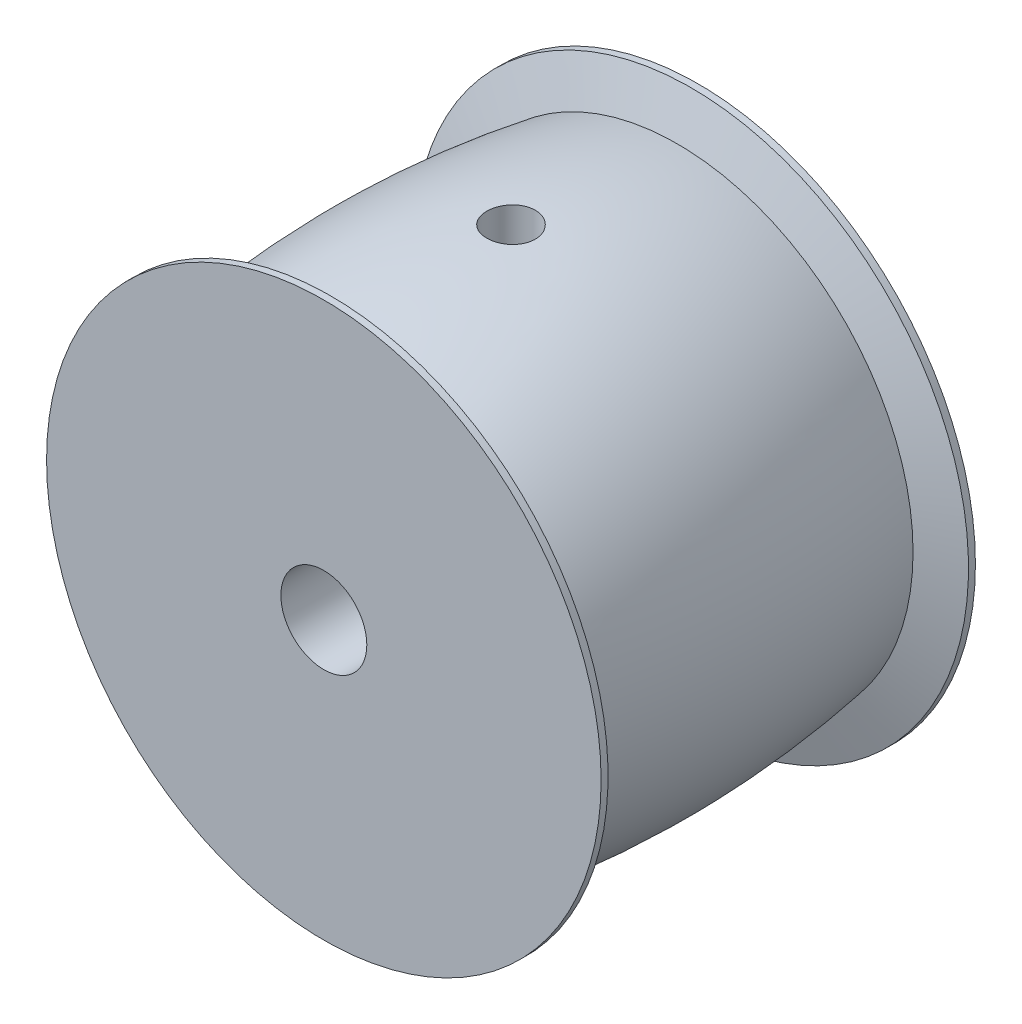
ISO-10303-21;
HEADER;
FILE_DESCRIPTION(('STEP AP214'),'2;1');
FILE_NAME('part.step','',(''),(''),'','','');
FILE_SCHEMA(('AUTOMOTIVE_DESIGN { 1 0 10303 214 1 1 1 1 }'));
ENDSEC;
DATA;
#1=APPLICATION_CONTEXT('core data for automotive mechanical design processes');
#2=APPLICATION_PROTOCOL_DEFINITION('international standard','automotive_design',2000,#1);
#3=PRODUCT_CONTEXT('',#1,'mechanical');
#4=PRODUCT('Part','Part','',(#3));
#5=PRODUCT_RELATED_PRODUCT_CATEGORY('part','',(#4));
#6=PRODUCT_DEFINITION_FORMATION('','',#4);
#7=PRODUCT_DEFINITION_CONTEXT('part definition',#1,'design');
#8=PRODUCT_DEFINITION('design','',#6,#7);
#9=PRODUCT_DEFINITION_SHAPE('','',#8);
#10=(LENGTH_UNIT() NAMED_UNIT(*) SI_UNIT(.MILLI.,.METRE.));
#11=(NAMED_UNIT(*) PLANE_ANGLE_UNIT() SI_UNIT($,.RADIAN.));
#12=(NAMED_UNIT(*) SI_UNIT($,.STERADIAN.) SOLID_ANGLE_UNIT());
#13=UNCERTAINTY_MEASURE_WITH_UNIT(LENGTH_MEASURE(1.E-05),#10,'distance_accuracy_value','');
#14=(GEOMETRIC_REPRESENTATION_CONTEXT(3) GLOBAL_UNCERTAINTY_ASSIGNED_CONTEXT((#13)) GLOBAL_UNIT_ASSIGNED_CONTEXT((#10,
#11,#12)) REPRESENTATION_CONTEXT('',''));
#15=CARTESIAN_POINT('',(0.,0.,0.));
#16=DIRECTION('',(0.,0.,1.));
#17=DIRECTION('',(1.,0.,0.));
#18=AXIS2_PLACEMENT_3D('',#15,#16,#17);
#19=CARTESIAN_POINT('',(0.,0.,15.));
#20=DIRECTION('',(0.,0.,-1.));
#21=DIRECTION('',(-1.,0.,0.));
#22=AXIS2_PLACEMENT_3D('',#19,#20,#21);
#23=CYLINDRICAL_SURFACE('',#22,20.);
#24=CARTESIAN_POINT('',(0.,0.,26.5));
#25=DIRECTION('',(0.,0.,-1.));
#26=DIRECTION('',(-1.,0.,0.));
#27=AXIS2_PLACEMENT_3D('',#24,#25,#26);
#28=CIRCLE('',#27,20.);
#29=CARTESIAN_POINT('',(-20.,0.,26.5));
#30=VERTEX_POINT('',#29);
#31=EDGE_CURVE('E102',#30,#30,#28,.T.);
#32=ORIENTED_EDGE('',*,*,#31,.F.);
#33=EDGE_LOOP('',(#32));
#34=FACE_BOUND('',#33,.T.);
#35=CARTESIAN_POINT('',(0.,0.,27.));
#36=DIRECTION('',(0.,0.,1.));
#37=DIRECTION('',(1.,0.,0.));
#38=AXIS2_PLACEMENT_3D('',#35,#36,#37);
#39=CIRCLE('',#38,20.);
#40=CARTESIAN_POINT('',(20.,0.,27.));
#41=VERTEX_POINT('',#40);
#42=EDGE_CURVE('E50',#41,#41,#39,.T.);
#43=ORIENTED_EDGE('',*,*,#42,.F.);
#44=EDGE_LOOP('',(#43));
#45=FACE_BOUND('',#44,.T.);
#46=ADVANCED_FACE('F33',(#34,#45),#23,.T.);
#47=CARTESIAN_POINT('',(0.,0.,15.));
#48=DIRECTION('',(0.,0.,-1.));
#49=DIRECTION('',(-1.,0.,0.));
#50=AXIS2_PLACEMENT_3D('',#47,#48,#49);
#51=CYLINDRICAL_SURFACE('',#50,3.1);
#52=CARTESIAN_POINT('',(0.,-3.1,15.25));
#53=CARTESIAN_POINT('',(0.090621719283177,-3.10000420251891,15.2500047849042));
#54=CARTESIAN_POINT('',(0.181216357350658,-3.09599361262121,15.2429313050754));
#55=CARTESIAN_POINT('',(0.35957780199557,-3.08037600695116,15.2150365486299));
#56=CARTESIAN_POINT('',(0.447344414991771,-3.06876847231424,15.1942143329859));
#57=CARTESIAN_POINT('',(0.617310726588606,-3.0391370149575,15.1399286560735));
#58=CARTESIAN_POINT('',(0.699529692760567,-3.02113682197074,15.1065119183129));
#59=CARTESIAN_POINT('',(0.857031711210553,-2.98028939192881,15.0283112983114));
#60=CARTESIAN_POINT('',(0.932313034626219,-2.95744095134875,14.983524593056));
#61=CARTESIAN_POINT('',(1.07978906311454,-2.90698346095951,14.8802986521798));
#62=CARTESIAN_POINT('',(1.15138593607805,-2.87915167623758,14.8211162862625));
#63=CARTESIAN_POINT('',(1.28421331975523,-2.8224144507107,14.6924183335605));
#64=CARTESIAN_POINT('',(1.34543279861919,-2.79350790666607,14.622891895911));
#65=CARTESIAN_POINT('',(1.46229411961439,-2.73430465023166,14.4667887965138));
#66=CARTESIAN_POINT('',(1.5166665735016,-2.70418289998332,14.3791872394937));
#67=CARTESIAN_POINT('',(1.609675881698,-2.64987937042414,14.1943384057256));
#68=CARTESIAN_POINT('',(1.64833593628469,-2.62568885440689,14.0971056160422));
#69=CARTESIAN_POINT('',(1.70150963094453,-2.59145518002551,13.9173157462224));
#70=CARTESIAN_POINT('',(1.71943816550077,-2.57948333998774,13.8361362288567));
#71=CARTESIAN_POINT('',(1.74357771038549,-2.56323199559777,13.6713291153105));
#72=CARTESIAN_POINT('',(1.74980081806947,-2.55894454977383,13.5877041373724));
#73=CARTESIAN_POINT('',(1.75019000557479,-2.55867835879088,13.4203114066287));
#74=CARTESIAN_POINT('',(1.74434110099241,-2.56270993963493,13.3365436054935));
#75=CARTESIAN_POINT('',(1.72089819107621,-2.57850748792416,13.1714028802869));
#76=CARTESIAN_POINT('',(1.70329630726807,-2.59027864342314,13.0900316009248));
#77=CARTESIAN_POINT('',(1.657249219719,-2.61997411465452,12.9318407189205));
#78=CARTESIAN_POINT('',(1.62882584343232,-2.63788603698261,12.8550123111496));
#79=CARTESIAN_POINT('',(1.56211502771627,-2.6779296445262,12.7069694820497));
#80=CARTESIAN_POINT('',(1.52382377482534,-2.70006296024663,12.6357572450279));
#81=CARTESIAN_POINT('',(1.43152641798009,-2.75025461648012,12.4891258094877));
#82=CARTESIAN_POINT('',(1.37599821655095,-2.77869797678232,12.4147951010557));
#83=CARTESIAN_POINT('',(1.25396554584119,-2.83586261379248,12.2758130695992));
#84=CARTESIAN_POINT('',(1.18745202051661,-2.86458410123713,12.2111698172564));
#85=CARTESIAN_POINT('',(1.03668696229015,-2.92275316652969,12.0863673803893));
#86=CARTESIAN_POINT('',(0.951294520660871,-2.95194248846239,12.0274520824283));
#87=CARTESIAN_POINT('',(0.770019788773487,-3.00432119579068,11.9250773148562));
#88=CARTESIAN_POINT('',(0.674144309711803,-3.02751444446835,11.8816078866452));
#89=CARTESIAN_POINT('',(0.481557855383653,-3.06382395270728,11.814696030865));
#90=CARTESIAN_POINT('',(0.385375466158948,-3.07753210375159,11.7900644089745));
#91=CARTESIAN_POINT('',(0.18940720801987,-3.09576725220434,11.7574546104323));
#92=CARTESIAN_POINT('',(0.0896248164390424,-3.10030288006434,11.7494607790322));
#93=CARTESIAN_POINT('',(-0.0980017075441083,-3.09970207643259,11.7505301242385));
#94=CARTESIAN_POINT('',(-0.185867474628647,-3.09564209414477,11.7576948777465));
#95=CARTESIAN_POINT('',(-0.3589156589367,-3.08037695843105,11.7849634646361));
#96=CARTESIAN_POINT('',(-0.444098011144977,-3.06917163202338,11.8050676112677));
#97=CARTESIAN_POINT('',(-0.608959335053683,-3.04074411584778,11.8571081704522));
#98=CARTESIAN_POINT('',(-0.688673862285319,-3.02356633060952,11.8889573631218));
#99=CARTESIAN_POINT('',(-0.841697084178722,-2.9845918539727,11.9633506618381));
#100=CARTESIAN_POINT('',(-0.915004155989898,-2.96279399718413,12.0058974668093));
#101=CARTESIAN_POINT('',(-1.06131590983964,-2.91378805642279,12.1054634829432));
#102=CARTESIAN_POINT('',(-1.13350006162199,-2.8862532905604,12.1635262572151));
#103=CARTESIAN_POINT('',(-1.26766006186162,-2.82990189416845,12.2900193281403));
#104=CARTESIAN_POINT('',(-1.32962423801516,-2.80108384502935,12.3584613101171));
#105=CARTESIAN_POINT('',(-1.4483101193777,-2.74176063331579,12.5124125153855));
#106=CARTESIAN_POINT('',(-1.50376450235781,-2.71140414934628,12.5989639401409));
#107=CARTESIAN_POINT('',(-1.59916222017647,-2.65626254192791,12.7818245720597));
#108=CARTESIAN_POINT('',(-1.63912683182613,-2.63146979596913,12.8781201635135));
#109=CARTESIAN_POINT('',(-1.69500276264145,-2.59573205017385,13.0569528170842));
#110=CARTESIAN_POINT('',(-1.71421311952257,-2.58296753495272,13.1380942756812));
#111=CARTESIAN_POINT('',(-1.74088606523093,-2.56506991649936,13.3030768973195));
#112=CARTESIAN_POINT('',(-1.74836130884322,-2.55992859298443,13.38691505259));
#113=CARTESIAN_POINT('',(-1.75115719838956,-2.55801730566599,13.5550311902692));
#114=CARTESIAN_POINT('',(-1.74645764108732,-2.56126125662316,13.6393096718461));
#115=CARTESIAN_POINT('',(-1.72514079922644,-2.57566430823171,13.8056670468276));
#116=CARTESIAN_POINT('',(-1.70851590670897,-2.58682846165324,13.8877445013578));
#117=CARTESIAN_POINT('',(-1.66442524342969,-2.61540839414585,14.0467439303562));
#118=CARTESIAN_POINT('',(-1.63707880158631,-2.63275517474297,14.1237121035432));
#119=CARTESIAN_POINT('',(-1.57251492761298,-2.67181908680955,14.2721776125399));
#120=CARTESIAN_POINT('',(-1.53529376812203,-2.69353786780813,14.3436728693567));
#121=CARTESIAN_POINT('',(-1.44546159201793,-2.74292685662782,14.4907881557946));
#122=CARTESIAN_POINT('',(-1.39136788617803,-2.77099932971367,14.5653685163073));
#123=CARTESIAN_POINT('',(-1.27227786041018,-2.827660452016,14.7050920868116));
#124=CARTESIAN_POINT('',(-1.20727262838111,-2.85624950598311,14.7702275008281));
#125=CARTESIAN_POINT('',(-1.05924055689136,-2.91462486754668,14.89679874493));
#126=CARTESIAN_POINT('',(-0.974999821217384,-2.94416881379113,14.9569409200432));
#127=CARTESIAN_POINT('',(-0.795854843469342,-2.99755431783949,15.0620115094093));
#128=CARTESIAN_POINT('',(-0.700955479625781,-3.02139846881429,15.1069468460271));
#129=CARTESIAN_POINT('',(-0.506832175960585,-3.05982383972062,15.1780594031446));
#130=CARTESIAN_POINT('',(-0.407914528992365,-3.07472578487656,15.2048910633051));
#131=CARTESIAN_POINT('',(-0.205983432409905,-3.09480656105867,15.2408496910258));
#132=CARTESIAN_POINT('',(-0.102974232611705,-3.09999522464192,15.2499945628726));
#133=CARTESIAN_POINT('',(0.,-3.1,15.25));
#134=B_SPLINE_CURVE_WITH_KNOTS('',3,(#52,#53,#54,#55,#56,#57,#58,#59,#60,#61,#62,#63,#64,#65,
#66,#67,#68,#69,#70,#71,#72,#73,#74,#75,#76,#77,#78,#79,#80,#81,#82,#83,#84,#85,#86,#87,#88,#89,
#90,#91,#92,#93,#94,#95,#96,#97,#98,#99,#100,#101,#102,#103,#104,#105,#106,#107,#108,#109,#110,
#111,#112,#113,#114,#115,#116,#117,#118,#119,#120,#121,#122,#123,#124,#125,#126,#127,#128,#129,
#130,#131,#132,#133),.UNSPECIFIED.,.T.,.F.,(4,2,2,2,2,2,2,2,2,2,2,2,2,2,2,2,2,2,2,2,2,2,2,2,2,2,
2,2,2,2,2,2,2,2,2,2,2,2,2,2,4),(0.,0.271466722339989,0.542951987551191,0.813439847569154,
1.08399493198328,1.37374349629574,1.66379817644342,1.98444671591453,2.30462006375227,
2.55550701246357,2.80613453109937,3.05707332860612,3.30818050914895,3.5587838553999,
3.80948419344839,4.09945698422441,4.3896700260172,4.71131421440453,5.03275064739148,
5.33167950948762,5.63032697751422,5.89379305198118,6.15726550494582,6.41881954165163,
6.68043963274458,6.96920408004505,7.25829607704858,7.57827323727303,7.89780930462535,
8.14978702574133,8.40149283472429,8.65361659945996,8.9059013538109,9.15545448836201,
9.40510195486016,9.69290505427915,9.98094437394142,10.3022127318363,10.6233346465512,
10.9321173425277,11.2405872946947),.UNSPECIFIED.);
#135=CARTESIAN_POINT('',(0.,-3.1,15.25));
#136=VERTEX_POINT('',#135);
#137=EDGE_CURVE('E75',#136,#136,#134,.T.);
#138=ORIENTED_EDGE('',*,*,#137,.F.);
#139=EDGE_LOOP('',(#138));
#140=FACE_BOUND('',#139,.T.);
#141=CARTESIAN_POINT('',(0.,3.1,15.25));
#142=CARTESIAN_POINT('',(-0.090621719283177,3.10000420251891,15.2500047849042));
#143=CARTESIAN_POINT('',(-0.181216357350658,3.09599361262121,15.2429313050754));
#144=CARTESIAN_POINT('',(-0.35957780199557,3.08037600695116,15.2150365486299));
#145=CARTESIAN_POINT('',(-0.447344414991771,3.06876847231424,15.1942143329859));
#146=CARTESIAN_POINT('',(-0.617310726588606,3.0391370149575,15.1399286560735));
#147=CARTESIAN_POINT('',(-0.699529692760567,3.02113682197074,15.1065119183129));
#148=CARTESIAN_POINT('',(-0.857031711210553,2.98028939192881,15.0283112983114));
#149=CARTESIAN_POINT('',(-0.932313034626219,2.95744095134875,14.983524593056));
#150=CARTESIAN_POINT('',(-1.07978906311454,2.90698346095951,14.8802986521798));
#151=CARTESIAN_POINT('',(-1.15138593607805,2.87915167623758,14.8211162862625));
#152=CARTESIAN_POINT('',(-1.28421331975523,2.8224144507107,14.6924183335605));
#153=CARTESIAN_POINT('',(-1.34543279861919,2.79350790666607,14.622891895911));
#154=CARTESIAN_POINT('',(-1.46229411961439,2.73430465023166,14.4667887965138));
#155=CARTESIAN_POINT('',(-1.5166665735016,2.70418289998332,14.3791872394937));
#156=CARTESIAN_POINT('',(-1.609675881698,2.64987937042414,14.1943384057256));
#157=CARTESIAN_POINT('',(-1.64833593628469,2.62568885440689,14.0971056160422));
#158=CARTESIAN_POINT('',(-1.70150963094453,2.59145518002551,13.9173157462224));
#159=CARTESIAN_POINT('',(-1.71943816550077,2.57948333998774,13.8361362288567));
#160=CARTESIAN_POINT('',(-1.74357771038549,2.56323199559777,13.6713291153105));
#161=CARTESIAN_POINT('',(-1.74980081806947,2.55894454977383,13.5877041373724));
#162=CARTESIAN_POINT('',(-1.75019000557479,2.55867835879088,13.4203114066287));
#163=CARTESIAN_POINT('',(-1.74434110099241,2.56270993963493,13.3365436054935));
#164=CARTESIAN_POINT('',(-1.72089819107621,2.57850748792416,13.1714028802869));
#165=CARTESIAN_POINT('',(-1.70329630726807,2.59027864342314,13.0900316009248));
#166=CARTESIAN_POINT('',(-1.657249219719,2.61997411465452,12.9318407189205));
#167=CARTESIAN_POINT('',(-1.62882584343232,2.63788603698261,12.8550123111496));
#168=CARTESIAN_POINT('',(-1.56211502771627,2.6779296445262,12.7069694820497));
#169=CARTESIAN_POINT('',(-1.52382377482534,2.70006296024663,12.6357572450279));
#170=CARTESIAN_POINT('',(-1.43152641798009,2.75025461648012,12.4891258094877));
#171=CARTESIAN_POINT('',(-1.37599821655095,2.77869797678232,12.4147951010557));
#172=CARTESIAN_POINT('',(-1.25396554584119,2.83586261379248,12.2758130695992));
#173=CARTESIAN_POINT('',(-1.18745202051661,2.86458410123713,12.2111698172564));
#174=CARTESIAN_POINT('',(-1.03668696229015,2.92275316652969,12.0863673803893));
#175=CARTESIAN_POINT('',(-0.951294520660871,2.95194248846239,12.0274520824283));
#176=CARTESIAN_POINT('',(-0.770019788773487,3.00432119579068,11.9250773148562));
#177=CARTESIAN_POINT('',(-0.674144309711803,3.02751444446835,11.8816078866452));
#178=CARTESIAN_POINT('',(-0.481557855383653,3.06382395270728,11.814696030865));
#179=CARTESIAN_POINT('',(-0.385375466158948,3.07753210375159,11.7900644089745));
#180=CARTESIAN_POINT('',(-0.18940720801987,3.09576725220434,11.7574546104323));
#181=CARTESIAN_POINT('',(-0.0896248164390424,3.10030288006434,11.7494607790322));
#182=CARTESIAN_POINT('',(0.0980017075441083,3.09970207643259,11.7505301242385));
#183=CARTESIAN_POINT('',(0.185867474628647,3.09564209414477,11.7576948777465));
#184=CARTESIAN_POINT('',(0.3589156589367,3.08037695843105,11.7849634646361));
#185=CARTESIAN_POINT('',(0.444098011144977,3.06917163202338,11.8050676112677));
#186=CARTESIAN_POINT('',(0.608959335053683,3.04074411584778,11.8571081704522));
#187=CARTESIAN_POINT('',(0.688673862285319,3.02356633060952,11.8889573631218));
#188=CARTESIAN_POINT('',(0.841697084178722,2.9845918539727,11.9633506618381));
#189=CARTESIAN_POINT('',(0.915004155989898,2.96279399718413,12.0058974668093));
#190=CARTESIAN_POINT('',(1.06131590983964,2.91378805642279,12.1054634829432));
#191=CARTESIAN_POINT('',(1.13350006162199,2.8862532905604,12.1635262572151));
#192=CARTESIAN_POINT('',(1.26766006186162,2.82990189416845,12.2900193281403));
#193=CARTESIAN_POINT('',(1.32962423801516,2.80108384502935,12.3584613101171));
#194=CARTESIAN_POINT('',(1.4483101193777,2.74176063331579,12.5124125153855));
#195=CARTESIAN_POINT('',(1.50376450235781,2.71140414934628,12.5989639401409));
#196=CARTESIAN_POINT('',(1.59916222017647,2.65626254192791,12.7818245720597));
#197=CARTESIAN_POINT('',(1.63912683182613,2.63146979596913,12.8781201635135));
#198=CARTESIAN_POINT('',(1.69500276264145,2.59573205017385,13.0569528170842));
#199=CARTESIAN_POINT('',(1.71421311952257,2.58296753495272,13.1380942756812));
#200=CARTESIAN_POINT('',(1.74088606523093,2.56506991649936,13.3030768973195));
#201=CARTESIAN_POINT('',(1.74836130884322,2.55992859298443,13.38691505259));
#202=CARTESIAN_POINT('',(1.75115719838956,2.55801730566599,13.5550311902692));
#203=CARTESIAN_POINT('',(1.74645764108732,2.56126125662316,13.6393096718461));
#204=CARTESIAN_POINT('',(1.72514079922644,2.57566430823171,13.8056670468276));
#205=CARTESIAN_POINT('',(1.70851590670897,2.58682846165324,13.8877445013578));
#206=CARTESIAN_POINT('',(1.66442524342969,2.61540839414585,14.0467439303562));
#207=CARTESIAN_POINT('',(1.63707880158631,2.63275517474297,14.1237121035432));
#208=CARTESIAN_POINT('',(1.57251492761298,2.67181908680955,14.2721776125399));
#209=CARTESIAN_POINT('',(1.53529376812203,2.69353786780813,14.3436728693567));
#210=CARTESIAN_POINT('',(1.44546159201793,2.74292685662782,14.4907881557946));
#211=CARTESIAN_POINT('',(1.39136788617803,2.77099932971367,14.5653685163073));
#212=CARTESIAN_POINT('',(1.27227786041018,2.827660452016,14.7050920868116));
#213=CARTESIAN_POINT('',(1.20727262838111,2.85624950598311,14.7702275008281));
#214=CARTESIAN_POINT('',(1.05924055689136,2.91462486754668,14.89679874493));
#215=CARTESIAN_POINT('',(0.974999821217384,2.94416881379113,14.9569409200432));
#216=CARTESIAN_POINT('',(0.795854843469342,2.99755431783949,15.0620115094093));
#217=CARTESIAN_POINT('',(0.700955479625781,3.02139846881429,15.1069468460271));
#218=CARTESIAN_POINT('',(0.506832175960585,3.05982383972062,15.1780594031446));
#219=CARTESIAN_POINT('',(0.407914528992365,3.07472578487656,15.2048910633051));
#220=CARTESIAN_POINT('',(0.205983432409905,3.09480656105867,15.2408496910258));
#221=CARTESIAN_POINT('',(0.102974232611705,3.09999522464192,15.2499945628726));
#222=CARTESIAN_POINT('',(0.,3.1,15.25));
#223=B_SPLINE_CURVE_WITH_KNOTS('',3,(#141,#142,#143,#144,#145,#146,#147,#148,#149,#150,#151,
#152,#153,#154,#155,#156,#157,#158,#159,#160,#161,#162,#163,#164,#165,#166,#167,#168,#169,#170,
#171,#172,#173,#174,#175,#176,#177,#178,#179,#180,#181,#182,#183,#184,#185,#186,#187,#188,#189,
#190,#191,#192,#193,#194,#195,#196,#197,#198,#199,#200,#201,#202,#203,#204,#205,#206,#207,#208,
#209,#210,#211,#212,#213,#214,#215,#216,#217,#218,#219,#220,#221,#222),.UNSPECIFIED.,.T.,.F.,(4,
2,2,2,2,2,2,2,2,2,2,2,2,2,2,2,2,2,2,2,2,2,2,2,2,2,2,2,2,2,2,2,2,2,2,2,2,2,2,2,4),(0.,
0.271466722339989,0.542951987551191,0.813439847569154,1.08399493198328,1.37374349629574,
1.66379817644342,1.98444671591453,2.30462006375227,2.55550701246357,2.80613453109937,
3.05707332860612,3.30818050914895,3.5587838553999,3.80948419344839,4.09945698422441,
4.3896700260172,4.71131421440453,5.03275064739148,5.33167950948762,5.63032697751422,
5.89379305198118,6.15726550494582,6.41881954165163,6.68043963274458,6.96920408004505,
7.25829607704858,7.57827323727303,7.89780930462535,8.14978702574133,8.40149283472429,
8.65361659945996,8.9059013538109,9.15545448836201,9.40510195486016,9.69290505427915,
9.98094437394142,10.3022127318363,10.6233346465512,10.9321173425277,11.2405872946947),.UNSPECIFIED.);
#224=CARTESIAN_POINT('',(0.,3.1,15.25));
#225=VERTEX_POINT('',#224);
#226=EDGE_CURVE('E70',#225,#225,#223,.T.);
#227=ORIENTED_EDGE('',*,*,#226,.F.);
#228=EDGE_LOOP('',(#227));
#229=FACE_BOUND('',#228,.T.);
#230=CARTESIAN_POINT('',(0.,0.,0.));
#231=DIRECTION('',(0.,0.,1.));
#232=DIRECTION('',(1.,0.,0.));
#233=AXIS2_PLACEMENT_3D('',#230,#231,#232);
#234=CIRCLE('',#233,3.1);
#235=CARTESIAN_POINT('',(3.1,0.,0.));
#236=VERTEX_POINT('',#235);
#237=EDGE_CURVE('E45',#236,#236,#234,.T.);
#238=ORIENTED_EDGE('',*,*,#237,.F.);
#239=EDGE_LOOP('',(#238));
#240=FACE_BOUND('',#239,.T.);
#241=CARTESIAN_POINT('',(0.,0.,27.));
#242=DIRECTION('',(0.,0.,1.));
#243=DIRECTION('',(1.,0.,0.));
#244=AXIS2_PLACEMENT_3D('',#241,#242,#243);
#245=CIRCLE('',#244,3.1);
#246=CARTESIAN_POINT('',(3.1,0.,27.));
#247=VERTEX_POINT('',#246);
#248=EDGE_CURVE('E116',#247,#247,#245,.T.);
#249=ORIENTED_EDGE('',*,*,#248,.T.);
#250=EDGE_LOOP('',(#249));
#251=FACE_BOUND('',#250,.T.);
#252=ADVANCED_FACE('F79',(#140,#229,#240,#251),#51,.F.);
#253=CARTESIAN_POINT('',(0.,0.,0.));
#254=DIRECTION('',(0.,0.,1.));
#255=DIRECTION('',(1.,0.,0.));
#256=AXIS2_PLACEMENT_3D('',#253,#254,#255);
#257=PLANE('',#256);
#258=CARTESIAN_POINT('',(0.,0.,0.));
#259=DIRECTION('',(0.,0.,1.));
#260=DIRECTION('',(1.,0.,0.));
#261=AXIS2_PLACEMENT_3D('',#258,#259,#260);
#262=CIRCLE('',#261,20.);
#263=CARTESIAN_POINT('',(20.,0.,0.));
#264=VERTEX_POINT('',#263);
#265=EDGE_CURVE('E11',#264,#264,#262,.T.);
#266=ORIENTED_EDGE('',*,*,#265,.F.);
#267=EDGE_LOOP('',(#266));
#268=FACE_BOUND('',#267,.T.);
#269=ORIENTED_EDGE('',*,*,#237,.T.);
#270=EDGE_LOOP('',(#269));
#271=FACE_BOUND('',#270,.T.);
#272=ADVANCED_FACE('F83',(#268,#271),#257,.F.);
#273=CARTESIAN_POINT('',(0.,0.,0.5));
#274=DIRECTION('',(0.,0.,-1.));
#275=DIRECTION('',(-1.,0.,0.));
#276=AXIS2_PLACEMENT_3D('',#273,#274,#275);
#277=CIRCLE('',#276,20.);
#278=CARTESIAN_POINT('',(-20.,0.,0.5));
#279=VERTEX_POINT('',#278);
#280=EDGE_CURVE('E106',#279,#279,#277,.T.);
#281=ORIENTED_EDGE('',*,*,#280,.T.);
#282=EDGE_LOOP('',(#281));
#283=FACE_BOUND('',#282,.T.);
#284=ORIENTED_EDGE('',*,*,#265,.T.);
#285=EDGE_LOOP('',(#284));
#286=FACE_BOUND('',#285,.T.);
#287=ADVANCED_FACE('F35',(#283,#286),#23,.T.);
#288=CARTESIAN_POINT('',(0.,0.,27.));
#289=DIRECTION('',(0.,0.,1.));
#290=DIRECTION('',(1.,0.,0.));
#291=AXIS2_PLACEMENT_3D('',#288,#289,#290);
#292=PLANE('',#291);
#293=ORIENTED_EDGE('',*,*,#42,.T.);
#294=EDGE_LOOP('',(#293));
#295=FACE_BOUND('',#294,.T.);
#296=ORIENTED_EDGE('',*,*,#248,.F.);
#297=EDGE_LOOP('',(#296));
#298=FACE_BOUND('',#297,.T.);
#299=ADVANCED_FACE('F85',(#295,#298),#292,.T.);
#300=CARTESIAN_POINT('',(0.,0.,26.5));
#301=DIRECTION('',(0.,0.,1.));
#302=DIRECTION('',(1.,0.,0.));
#303=AXIS2_PLACEMENT_3D('',#300,#301,#302);
#304=CONICAL_SURFACE('',#303,20.,1.24904577239825);
#305=CARTESIAN_POINT('',(0.,0.,25.5));
#306=DIRECTION('',(0.,0.,-1.));
#307=DIRECTION('',(-1.,0.,0.));
#308=AXIS2_PLACEMENT_3D('',#305,#306,#307);
#309=CIRCLE('',#308,17.);
#310=CARTESIAN_POINT('',(-17.,0.,25.5));
#311=VERTEX_POINT('',#310);
#312=EDGE_CURVE('E114',#311,#311,#309,.T.);
#313=ORIENTED_EDGE('',*,*,#312,.F.);
#314=EDGE_LOOP('',(#313));
#315=FACE_BOUND('',#314,.T.);
#316=ORIENTED_EDGE('',*,*,#31,.T.);
#317=EDGE_LOOP('',(#316));
#318=FACE_BOUND('',#317,.T.);
#319=ADVANCED_FACE('F140',(#315,#318),#304,.T.);
#320=CARTESIAN_POINT('',(0.,0.,1.5));
#321=DIRECTION('',(0.,0.,-1.));
#322=DIRECTION('',(-1.,0.,0.));
#323=AXIS2_PLACEMENT_3D('',#320,#321,#322);
#324=CONICAL_SURFACE('',#323,17.,1.24904577239825);
#325=ORIENTED_EDGE('',*,*,#280,.F.);
#326=EDGE_LOOP('',(#325));
#327=FACE_BOUND('',#326,.T.);
#328=CARTESIAN_POINT('',(0.,0.,1.5));
#329=DIRECTION('',(0.,0.,-1.));
#330=DIRECTION('',(-1.,0.,0.));
#331=AXIS2_PLACEMENT_3D('',#328,#329,#330);
#332=CIRCLE('',#331,17.);
#333=CARTESIAN_POINT('',(-17.,0.,1.5));
#334=VERTEX_POINT('',#333);
#335=EDGE_CURVE('E111',#334,#334,#332,.T.);
#336=ORIENTED_EDGE('',*,*,#335,.T.);
#337=EDGE_LOOP('',(#336));
#338=FACE_BOUND('',#337,.T.);
#339=ADVANCED_FACE('F134',(#327,#338),#324,.T.);
#340=CARTESIAN_POINT('',(0.,0.,13.5));
#341=DIRECTION('',(0.,0.,-1.));
#342=DIRECTION('',(-1.,0.,0.));
#343=AXIS2_PLACEMENT_3D('',#340,#341,#342);
#344=DEGENERATE_TOROIDAL_SURFACE('',#343,54.4999999999998,72.4999999999998,.F.);
#345=CARTESIAN_POINT('',(-1.24650911169295,-17.9463567027951,12.2717023835944));
#346=CARTESIAN_POINT('',(-1.31547109758702,-17.9427554956403,12.3416928270515));
#347=CARTESIAN_POINT('',(-1.37857316675917,-17.9391599101084,12.4175528258213));
#348=CARTESIAN_POINT('',(-1.49120764610483,-17.9323863909267,12.5788608593152));
#349=CARTESIAN_POINT('',(-1.54072447571049,-17.929208938978,12.6643197458245));
#350=CARTESIAN_POINT('',(-1.62470186401822,-17.9236353899788,12.8423363245396));
#351=CARTESIAN_POINT('',(-1.65916786520189,-17.9212390105666,12.9348914364462));
#352=CARTESIAN_POINT('',(-1.7120633454067,-17.9174988663268,13.12447041602));
#353=CARTESIAN_POINT('',(-1.73049682703161,-17.9161548387822,13.2214931619462));
#354=CARTESIAN_POINT('',(-1.7507943664002,-17.9146724480638,13.4171044940591));
#355=CARTESIAN_POINT('',(-1.75268566780665,-17.9145321025283,13.5156902376855));
#356=CARTESIAN_POINT('',(-1.73991464585897,-17.9154678492782,13.7117807472759));
#357=CARTESIAN_POINT('',(-1.72525179956083,-17.9165439799918,13.8092854789926));
#358=CARTESIAN_POINT('',(-1.6798199943773,-17.9197888200755,14.0003354749094));
#359=CARTESIAN_POINT('',(-1.64906848888844,-17.9219563453766,14.0938849112894));
#360=CARTESIAN_POINT('',(-1.57234957389658,-17.9271386081881,14.2744957611732));
#361=CARTESIAN_POINT('',(-1.52638200301634,-17.9301533546837,14.3615571058541));
#362=CARTESIAN_POINT('',(-1.42043551524663,-17.9366971104715,14.526899022216));
#363=CARTESIAN_POINT('',(-1.36043057926311,-17.940227070116,14.6051628834739));
#364=CARTESIAN_POINT('',(-1.22815142236227,-17.9473999811854,14.7505202915023));
#365=CARTESIAN_POINT('',(-1.15587706566715,-17.9510429338605,14.8176137146405));
#366=CARTESIAN_POINT('',(-1.00094649359484,-17.9580394882755,14.9388536201132));
#367=CARTESIAN_POINT('',(-0.918270968848911,-17.9613925317535,14.9929754638032));
#368=CARTESIAN_POINT('',(-0.744982738877172,-17.9674238339166,15.0865678633378));
#369=CARTESIAN_POINT('',(-0.654370083253188,-17.9701020968182,15.1260385107346));
#370=CARTESIAN_POINT('',(-0.467874533506267,-17.9744796161155,15.1891639009831));
#371=CARTESIAN_POINT('',(-0.371997157641036,-17.976179876937,15.2128348744097));
#372=CARTESIAN_POINT('',(-0.177616326711895,-17.9784139879874,15.2437421922602));
#373=CARTESIAN_POINT('',(-0.0791129144210509,-17.9789478572028,15.2509788042028));
#374=CARTESIAN_POINT('',(0.117479474500686,-17.9787892182761,15.2488109121242));
#375=CARTESIAN_POINT('',(0.215568882186633,-17.9780995595657,15.2394450730165));
#376=CARTESIAN_POINT('',(0.408777886249428,-17.9755768813622,15.2044177454975));
#377=CARTESIAN_POINT('',(0.503897481730129,-17.973743861524,15.178756252169));
#378=CARTESIAN_POINT('',(0.688473821106296,-17.969140075603,15.1118744892195));
#379=CARTESIAN_POINT('',(0.77793058253908,-17.9663693124243,15.0706542677855));
#380=CARTESIAN_POINT('',(0.948663260429771,-17.9602003010103,14.9738282336313));
#381=CARTESIAN_POINT('',(1.02993904804781,-17.9568020428951,14.9182221944023));
#382=CARTESIAN_POINT('',(1.18220487738392,-17.9497500303688,14.7940497876597));
#383=CARTESIAN_POINT('',(1.25317057569967,-17.94609570053,14.7254536002409));
#384=CARTESIAN_POINT('',(1.38258942673024,-17.9389495272154,14.5773206417533));
#385=CARTESIAN_POINT('',(1.44104249000222,-17.9354576849012,14.4977837924851));
#386=CARTESIAN_POINT('',(1.54383384989373,-17.9290267558839,14.3299233081026));
#387=CARTESIAN_POINT('',(1.58815735272953,-17.9260882498376,14.2415905897515));
#388=CARTESIAN_POINT('',(1.66133714490197,-17.9211017355362,14.0587114943317));
#389=CARTESIAN_POINT('',(1.69019363995891,-17.9190537154372,13.9641651999261));
#390=CARTESIAN_POINT('',(1.73156856238046,-17.9160839831603,13.7717311682972));
#391=CARTESIAN_POINT('',(1.74411752540475,-17.9151601661325,13.6738500294044));
#392=CARTESIAN_POINT('',(1.75261431186694,-17.9145368642651,13.4773665643154));
#393=CARTESIAN_POINT('',(1.7485623382227,-17.9148373644603,13.3787642469489));
#394=CARTESIAN_POINT('',(1.72399833297615,-17.9166267696164,13.1838315718577));
#395=CARTESIAN_POINT('',(1.70351711252392,-17.9181134500057,13.087497308445));
#396=CARTESIAN_POINT('',(1.64672228313389,-17.9221041860785,12.8996374528459));
#397=CARTESIAN_POINT('',(1.61040857270441,-17.9246082482838,12.8081118914892));
#398=CARTESIAN_POINT('',(1.52293818840637,-17.9303544453354,12.6323567411853));
#399=CARTESIAN_POINT('',(1.47176583287292,-17.9335973591756,12.5481349831898));
#400=CARTESIAN_POINT('',(1.35604280392448,-17.9404548108283,12.3894639128381));
#401=CARTESIAN_POINT('',(1.29149189611786,-17.9440693551512,12.315014771735));
#402=CARTESIAN_POINT('',(1.15066453313966,-17.9512728900727,12.177821087932));
#403=CARTESIAN_POINT('',(1.0743610764066,-17.9548618013912,12.1151042543278));
#404=CARTESIAN_POINT('',(0.912292178039053,-17.961601539065,12.0033668378526));
#405=CARTESIAN_POINT('',(0.826526722427254,-17.9647523647732,11.9543462752142));
#406=CARTESIAN_POINT('',(0.647959500539979,-17.9702611692449,11.8713994220741));
#407=CARTESIAN_POINT('',(0.555157802235959,-17.9726191556663,11.8374729857821));
#408=CARTESIAN_POINT('',(0.365157911157049,-17.9762763377681,11.785691367084));
#409=CARTESIAN_POINT('',(0.267959952084895,-17.9775755896607,11.7678353314367));
#410=CARTESIAN_POINT('',(0.0721766246803304,-17.9789671819919,11.7487314248335));
#411=CARTESIAN_POINT('',(-0.0264047934929061,-17.9790624506583,11.747443258748));
#412=CARTESIAN_POINT('',(-0.222406910065981,-17.9780427122339,11.7614118379341));
#413=CARTESIAN_POINT('',(-0.319827338246628,-17.9769274287432,11.7766723616936));
#414=CARTESIAN_POINT('',(-0.510653180508769,-17.9736129427141,11.8232832112367));
#415=CARTESIAN_POINT('',(-0.60406077289256,-17.9714143365337,11.8546246850151));
#416=CARTESIAN_POINT('',(-0.784211086816393,-17.9661812484875,11.9324792261852));
#417=CARTESIAN_POINT('',(-0.870961188418875,-17.9631477098038,11.9789751851551));
#418=CARTESIAN_POINT('',(-1.00619961694551,-17.9577522205696,12.0667965299507));
#419=CARTESIAN_POINT('',(-1.05734698858045,-17.9555335987582,12.1041083210585));
#420=CARTESIAN_POINT('',(-1.15530847825255,-17.9509947760888,12.1840370026923));
#421=CARTESIAN_POINT('',(-1.20212258682644,-17.948674575009,12.2266539048035));
#422=CARTESIAN_POINT('',(-1.24650911169295,-17.9463567027951,12.2717023835944));
#423=B_SPLINE_CURVE_WITH_KNOTS('',3,(#345,#346,#347,#348,#349,#350,#351,#352,#353,#354,#355,
#356,#357,#358,#359,#360,#361,#362,#363,#364,#365,#366,#367,#368,#369,#370,#371,#372,#373,#374,
#375,#376,#377,#378,#379,#380,#381,#382,#383,#384,#385,#386,#387,#388,#389,#390,#391,#392,#393,
#394,#395,#396,#397,#398,#399,#400,#401,#402,#403,#404,#405,#406,#407,#408,#409,#410,#411,#412,
#413,#414,#415,#416,#417,#418,#419,#420,#421,#422),.UNSPECIFIED.,.T.,.F.,(4,2,2,2,2,2,2,2,2,2,2,
2,2,2,2,2,2,2,2,2,2,2,2,2,2,2,2,2,2,2,2,2,2,2,2,2,2,2,4),(0.,0.294738516198979,
0.589813660788999,0.884782015671096,1.17967670897949,1.47408564241159,1.76850387645542,
2.06260337817476,2.35670599912907,2.65135813766065,2.94601353713081,3.24122425629,
3.53643313070882,3.83133827642582,4.12623862163844,4.42045308494115,4.7146676370228,
5.00888127790226,5.30309955154535,5.59800159839687,5.89290575319763,6.18811766897926,
6.48332565817119,6.77798007360726,7.07263088741121,7.36673040601684,7.66083180992898,
7.95524474075771,8.24966283012358,8.54476772480784,8.83987305542827,9.13497553563759,
9.43006234676142,9.72443133378066,10.0188675468988,10.3131418567004,10.6070850941477,
10.7967894615505,10.9864942432324),.UNSPECIFIED.);
#424=CARTESIAN_POINT('',(-1.24650911169295,-17.9463567027951,12.2717023835944));
#425=VERTEX_POINT('',#424);
#426=EDGE_CURVE('E37',#425,#425,#423,.T.);
#427=ORIENTED_EDGE('',*,*,#426,.T.);
#428=EDGE_LOOP('',(#427));
#429=FACE_BOUND('',#428,.T.);
#430=CARTESIAN_POINT('',(-1.24650911169295,17.9463567027951,12.2717023835944));
#431=CARTESIAN_POINT('',(-1.17753555054152,17.9499582164224,12.2017121649427));
#432=CARTESIAN_POINT('',(-1.10260624641046,17.9535700348558,12.1374961765757));
#433=CARTESIAN_POINT('',(-0.942960449163455,17.960406779391,12.0224938007192));
#434=CARTESIAN_POINT('',(-0.858232859680421,17.9636312582478,11.9717228577496));
#435=CARTESIAN_POINT('',(-0.681458047798115,17.9693260360929,11.8851335066675));
#436=CARTESIAN_POINT('',(-0.589413507852165,17.9717966098762,11.849309648655));
#437=CARTESIAN_POINT('',(-0.400619657206479,17.9757059747462,11.7936329595117));
#438=CARTESIAN_POINT('',(-0.303871528145983,17.9771450235577,11.7737761388914));
#439=CARTESIAN_POINT('',(-0.108562329581523,17.9788288317114,11.7506090464543));
#440=CARTESIAN_POINT('',(-0.0100044496844435,17.9790755213195,11.7472720311263));
#441=CARTESIAN_POINT('',(0.186274139584833,17.9783520673062,11.757169501842));
#442=CARTESIAN_POINT('',(0.283994823083111,17.9773818862124,11.770404498204));
#443=CARTESIAN_POINT('',(0.475702074679883,17.9743355879689,11.8130386624012));
#444=CARTESIAN_POINT('',(0.569692963690587,17.9722607932257,11.8424185035168));
#445=CARTESIAN_POINT('',(0.751409801087935,17.9672385597096,11.9164879333627));
#446=CARTESIAN_POINT('',(0.839135687920327,17.9642911123642,11.9611776724892));
#447=CARTESIAN_POINT('',(1.00600242653815,17.9578475957018,12.0646896189047));
#448=CARTESIAN_POINT('',(1.08512790550682,17.9543505704597,12.1235365474173));
#449=CARTESIAN_POINT('',(1.23239079712403,17.9472039068965,12.2536582629123));
#450=CARTESIAN_POINT('',(1.30052808066125,17.9435542667828,12.3249331959033));
#451=CARTESIAN_POINT('',(1.42401682554992,17.9365052618169,12.4780563147188));
#452=CARTESIAN_POINT('',(1.47934287052372,17.9331064034385,12.5599250247565));
#453=CARTESIAN_POINT('',(1.57546301433559,17.9269511564773,12.7318124058968));
#454=CARTESIAN_POINT('',(1.61625719089333,17.9241947644586,12.8218310334086));
#455=CARTESIAN_POINT('',(1.68211511782878,17.9196392271168,13.007382854194));
#456=CARTESIAN_POINT('',(1.70719284625285,17.9178392314024,13.1029110644745));
#457=CARTESIAN_POINT('',(1.74095106275848,17.9153974362047,13.296836003205));
#458=CARTESIAN_POINT('',(1.74963182450153,17.9147556173917,13.3952326837533));
#459=CARTESIAN_POINT('',(1.75034435542141,17.9147032864655,13.5918524620674));
#460=CARTESIAN_POINT('',(1.74241553459085,17.9152898597131,13.6900754185288));
#461=CARTESIAN_POINT('',(1.71021787790706,17.9176218371037,13.8837908715625));
#462=CARTESIAN_POINT('',(1.68594905063305,17.9193672406383,13.9792833695682));
#463=CARTESIAN_POINT('',(1.6217733936368,17.9238190203481,14.1648198739423));
#464=CARTESIAN_POINT('',(1.58186881354307,17.9265252582759,14.2548646619615));
#465=CARTESIAN_POINT('',(1.48755796567244,17.9325937060624,14.4269852858773));
#466=CARTESIAN_POINT('',(1.43315147168642,17.9359559261534,14.5090609974406));
#467=CARTESIAN_POINT('',(1.31123251777684,17.9429668765188,14.6631168426887));
#468=CARTESIAN_POINT('',(1.24369011698291,17.9466162497716,14.7350732531449));
#469=CARTESIAN_POINT('',(1.09748554726478,17.9537842007597,14.8666370514694));
#470=CARTESIAN_POINT('',(1.01882329108022,17.9573027774684,14.9262443424219));
#471=CARTESIAN_POINT('',(0.852498732565071,17.9638175089221,15.0314834841751));
#472=CARTESIAN_POINT('',(0.764826102689697,17.9668130533238,15.0770990539192));
#473=CARTESIAN_POINT('',(0.583040774934651,17.9719390501314,15.1529558806308));
#474=CARTESIAN_POINT('',(0.488928158005235,17.9740695134089,15.1831973308097));
#475=CARTESIAN_POINT('',(0.297112515164955,17.9772221221056,15.2273950064678));
#476=CARTESIAN_POINT('',(0.199416198826116,17.978246239316,15.2413802081285));
#477=CARTESIAN_POINT('',(0.00305754190656658,17.9790775772739,15.2527583673032));
#478=CARTESIAN_POINT('',(-0.0956047863849607,17.978884813482,15.2501515356207));
#479=CARTESIAN_POINT('',(-0.290893071037222,17.9773057091488,15.2284429278865));
#480=CARTESIAN_POINT('',(-0.387522602729075,17.9759216820519,15.2093731228667));
#481=CARTESIAN_POINT('',(-0.576205188988652,17.9721184157669,15.1553302434753));
#482=CARTESIAN_POINT('',(-0.668258218956077,17.969699171015,15.1203570836278));
#483=CARTESIAN_POINT('',(-0.845272618599655,17.9640937846128,15.0354668043855));
#484=CARTESIAN_POINT('',(-0.930227381799318,17.9609069390204,14.98553595747));
#485=CARTESIAN_POINT('',(-1.09056195169028,17.9541245116294,14.8721572502881));
#486=CARTESIAN_POINT('',(-1.16594158852515,17.9505289225822,14.8087091502879));
#487=CARTESIAN_POINT('',(-1.30517169920512,17.9433233258595,14.6699193357037));
#488=CARTESIAN_POINT('',(-1.368994661072,17.9397133041574,14.5945500194086));
#489=CARTESIAN_POINT('',(-1.48308652818594,17.9328942399519,14.4341522480227));
#490=CARTESIAN_POINT('',(-1.53335539873764,17.9296851984749,14.3491237682073));
#491=CARTESIAN_POINT('',(-1.61891329913487,17.9240306153039,14.1717976816264));
#492=CARTESIAN_POINT('',(-1.65420017915386,17.9215851831967,14.0794990338862));
#493=CARTESIAN_POINT('',(-1.70876734912219,17.9177363288576,13.8902686722339));
#494=CARTESIAN_POINT('',(-1.72804848868061,17.9163328513176,13.7933372045278));
#495=CARTESIAN_POINT('',(-1.75002292329479,17.914729489436,13.5978396181336));
#496=CARTESIAN_POINT('',(-1.75275607154926,17.9145267134222,13.4992780004743));
#497=CARTESIAN_POINT('',(-1.74165868238972,17.9153402485978,13.303071987545));
#498=CARTESIAN_POINT('',(-1.72782437564834,17.9163568372097,13.2054278060994));
#499=CARTESIAN_POINT('',(-1.68400810248013,17.9194925788251,13.0139319824802));
#500=CARTESIAN_POINT('',(-1.65403723353141,17.9216109740572,12.9200777814813));
#501=CARTESIAN_POINT('',(-1.57882865101671,17.9267092604854,12.7388114078646));
#502=CARTESIAN_POINT('',(-1.5336081609152,17.9296881792337,12.6513921025507));
#503=CARTESIAN_POINT('',(-1.44778927022295,17.9350175127161,12.5149044834322));
#504=CARTESIAN_POINT('',(-1.41124455882829,17.9372158650936,12.4632348061471));
#505=CARTESIAN_POINT('',(-1.33279128174123,17.9417269574069,12.36414757778));
#506=CARTESIAN_POINT('',(-1.29088270501078,17.944039697578,12.3167300354487));
#507=CARTESIAN_POINT('',(-1.24650911169295,17.9463567027951,12.2717023835944));
#508=B_SPLINE_CURVE_WITH_KNOTS('',3,(#430,#431,#432,#433,#434,#435,#436,#437,#438,#439,#440,
#441,#442,#443,#444,#445,#446,#447,#448,#449,#450,#451,#452,#453,#454,#455,#456,#457,#458,#459,
#460,#461,#462,#463,#464,#465,#466,#467,#468,#469,#470,#471,#472,#473,#474,#475,#476,#477,#478,
#479,#480,#481,#482,#483,#484,#485,#486,#487,#488,#489,#490,#491,#492,#493,#494,#495,#496,#497,
#498,#499,#500,#501,#502,#503,#504,#505,#506,#507),.UNSPECIFIED.,.T.,.F.,(4,2,2,2,2,2,2,2,2,2,2,
2,2,2,2,2,2,2,2,2,2,2,2,2,2,2,2,2,2,2,2,2,2,2,2,2,2,2,4),(0.,0.294762483832875,
0.589862111131267,0.884854047075878,1.17977225405146,1.47421286862638,1.76866255042567,
2.06276051694239,2.3568613726026,2.65147956189005,2.94610121268944,3.24130245280164,
3.53650211408793,3.83143885386234,4.12637067116936,4.42060348871836,4.71483615178253,
5.00902649700729,5.30322143144958,5.59809495853342,5.89297079969388,6.18818847408103,
6.48340243828091,6.77808938329861,7.07277258429598,7.36688479567979,7.66099858784881,
7.95538313626088,8.24977290613127,8.54485454549883,8.83993694020063,9.1350616631728,
9.43017071947351,9.7245687690472,10.019033811015,10.3132966009157,10.6072281469008,
10.7968608619324,10.9864939672065),.UNSPECIFIED.);
#509=CARTESIAN_POINT('',(-1.24650911169295,17.9463567027951,12.2717023835944));
#510=VERTEX_POINT('',#509);
#511=EDGE_CURVE('E53',#510,#510,#508,.T.);
#512=ORIENTED_EDGE('',*,*,#511,.T.);
#513=EDGE_LOOP('',(#512));
#514=FACE_BOUND('',#513,.T.);
#515=ORIENTED_EDGE('',*,*,#335,.F.);
#516=EDGE_LOOP('',(#515));
#517=FACE_BOUND('',#516,.T.);
#518=ORIENTED_EDGE('',*,*,#312,.T.);
#519=EDGE_LOOP('',(#518));
#520=FACE_BOUND('',#519,.T.);
#521=ADVANCED_FACE('F57',(#429,#514,#517,#520),#344,.F.);
#522=CARTESIAN_POINT('',(0.,-20.,13.5));
#523=DIRECTION('',(0.,1.,0.));
#524=DIRECTION('',(0.,0.,1.));
#525=AXIS2_PLACEMENT_3D('',#522,#523,#524);
#526=CYLINDRICAL_SURFACE('',#525,1.75);
#527=ORIENTED_EDGE('',*,*,#226,.T.);
#528=EDGE_LOOP('',(#527));
#529=FACE_BOUND('',#528,.T.);
#530=ORIENTED_EDGE('',*,*,#511,.F.);
#531=EDGE_LOOP('',(#530));
#532=FACE_BOUND('',#531,.T.);
#533=ADVANCED_FACE('F63',(#529,#532),#526,.F.);
#534=ORIENTED_EDGE('',*,*,#137,.T.);
#535=EDGE_LOOP('',(#534));
#536=FACE_BOUND('',#535,.T.);
#537=ORIENTED_EDGE('',*,*,#426,.F.);
#538=EDGE_LOOP('',(#537));
#539=FACE_BOUND('',#538,.T.);
#540=ADVANCED_FACE('F60',(#536,#539),#526,.F.);
#541=CLOSED_SHELL('',(#46,#252,#272,#287,#299,#319,#339,#521,#533,#540));
#542=MANIFOLD_SOLID_BREP('B2',#541);
#543=ADVANCED_BREP_SHAPE_REPRESENTATION('',(#18,#542),#14);
#544=SHAPE_DEFINITION_REPRESENTATION(#9,#543);
ENDSEC;
END-ISO-10303-21;
